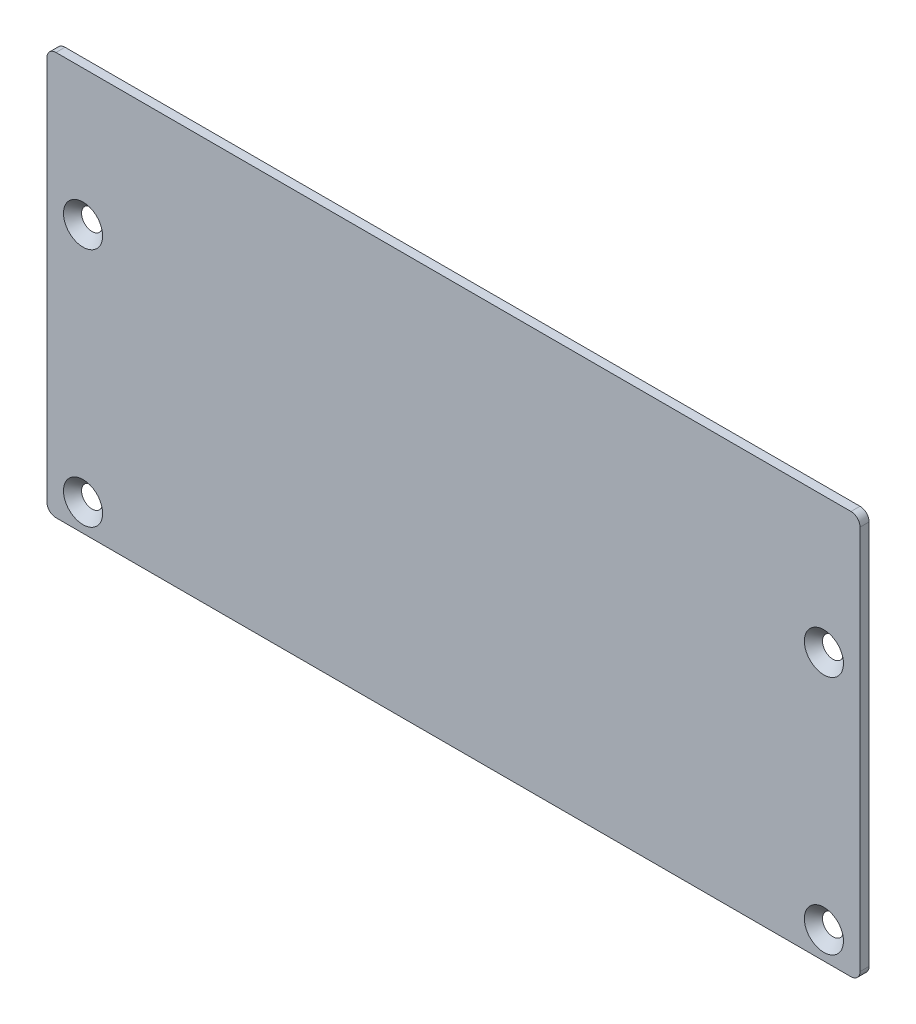
ISO-10303-21;
HEADER;
FILE_DESCRIPTION(('STEP AP214'),'2;1');
FILE_NAME('part.step','',(''),(''),'','','');
FILE_SCHEMA(('AUTOMOTIVE_DESIGN { 1 0 10303 214 1 1 1 1 }'));
ENDSEC;
DATA;
#1=APPLICATION_CONTEXT('core data for automotive mechanical design processes');
#2=APPLICATION_PROTOCOL_DEFINITION('international standard','automotive_design',2000,#1);
#3=PRODUCT_CONTEXT('',#1,'mechanical');
#4=PRODUCT('Part','Part','',(#3));
#5=PRODUCT_RELATED_PRODUCT_CATEGORY('part','',(#4));
#6=PRODUCT_DEFINITION_FORMATION('','',#4);
#7=PRODUCT_DEFINITION_CONTEXT('part definition',#1,'design');
#8=PRODUCT_DEFINITION('design','',#6,#7);
#9=PRODUCT_DEFINITION_SHAPE('','',#8);
#10=(LENGTH_UNIT() NAMED_UNIT(*) SI_UNIT(.MILLI.,.METRE.));
#11=(NAMED_UNIT(*) PLANE_ANGLE_UNIT() SI_UNIT($,.RADIAN.));
#12=(NAMED_UNIT(*) SI_UNIT($,.STERADIAN.) SOLID_ANGLE_UNIT());
#13=UNCERTAINTY_MEASURE_WITH_UNIT(LENGTH_MEASURE(1.E-05),#10,'distance_accuracy_value','');
#14=(GEOMETRIC_REPRESENTATION_CONTEXT(3) GLOBAL_UNCERTAINTY_ASSIGNED_CONTEXT((#13)) GLOBAL_UNIT_ASSIGNED_CONTEXT((#10,
#11,#12)) REPRESENTATION_CONTEXT('',''));
#15=CARTESIAN_POINT('',(0.,0.,0.));
#16=DIRECTION('',(0.,0.,1.));
#17=DIRECTION('',(1.,0.,0.));
#18=AXIS2_PLACEMENT_3D('',#15,#16,#17);
#19=CARTESIAN_POINT('',(-25.0657894736842,38.0216992481203,1.27));
#20=DIRECTION('',(1.,0.,0.));
#21=DIRECTION('',(0.,1.,0.));
#22=AXIS2_PLACEMENT_3D('',#19,#20,#21);
#23=PLANE('',#22);
#24=DIRECTION('',(0.,-1.,0.));
#25=VECTOR('',#24,1.);
#26=CARTESIAN_POINT('',(-25.0657894736842,38.0216992481203,0.));
#27=LINE('',#26,#25);
#28=CARTESIAN_POINT('',(-25.0657894736842,36.7516992481203,0.));
#29=VERTEX_POINT('',#28);
#30=CARTESIAN_POINT('',(-25.0657894736842,-17.3503007518797,0.));
#31=VERTEX_POINT('',#30);
#32=EDGE_CURVE('E141',#29,#31,#27,.T.);
#33=ORIENTED_EDGE('',*,*,#32,.T.);
#34=DIRECTION('',(0.,0.,-1.));
#35=VECTOR('',#34,1.);
#36=CARTESIAN_POINT('',(-25.0657894736842,-17.3503007518797,1.27));
#37=LINE('',#36,#35);
#38=CARTESIAN_POINT('',(-25.0657894736842,-17.3503007518797,1.27));
#39=VERTEX_POINT('',#38);
#40=EDGE_CURVE('E119',#31,#39,#37,.F.);
#41=ORIENTED_EDGE('',*,*,#40,.T.);
#42=DIRECTION('',(0.,-1.,0.));
#43=VECTOR('',#42,1.);
#44=CARTESIAN_POINT('',(-25.0657894736842,38.0216992481203,1.27));
#45=LINE('',#44,#43);
#46=CARTESIAN_POINT('',(-25.0657894736842,36.7516992481203,1.27));
#47=VERTEX_POINT('',#46);
#48=EDGE_CURVE('E151',#47,#39,#45,.T.);
#49=ORIENTED_EDGE('',*,*,#48,.F.);
#50=DIRECTION('',(0.,0.,-1.));
#51=VECTOR('',#50,1.);
#52=CARTESIAN_POINT('',(-25.0657894736842,36.7516992481203,1.27));
#53=LINE('',#52,#51);
#54=EDGE_CURVE('E124',#47,#29,#53,.T.);
#55=ORIENTED_EDGE('',*,*,#54,.T.);
#56=EDGE_LOOP('',(#33,#41,#49,#55));
#57=FACE_BOUND('',#56,.T.);
#58=ADVANCED_FACE('F48',(#57),#23,.F.);
#59=CARTESIAN_POINT('',(-25.0657894736842,-18.6203007518797,1.27));
#60=DIRECTION('',(0.,1.,0.));
#61=DIRECTION('',(0.,0.,1.));
#62=AXIS2_PLACEMENT_3D('',#59,#60,#61);
#63=PLANE('',#62);
#64=DIRECTION('',(1.,0.,0.));
#65=VECTOR('',#64,1.);
#66=CARTESIAN_POINT('',(-25.0657894736842,-18.6203007518797,1.27));
#67=LINE('',#66,#65);
#68=CARTESIAN_POINT('',(-23.7957894736842,-18.6203007518797,1.27));
#69=VERTEX_POINT('',#68);
#70=CARTESIAN_POINT('',(87.9642105263158,-18.6203007518797,1.27));
#71=VERTEX_POINT('',#70);
#72=EDGE_CURVE('E134',#69,#71,#67,.T.);
#73=ORIENTED_EDGE('',*,*,#72,.F.);
#74=DIRECTION('',(0.,0.,-1.));
#75=VECTOR('',#74,1.);
#76=CARTESIAN_POINT('',(-23.7957894736842,-18.6203007518797,1.27));
#77=LINE('',#76,#75);
#78=CARTESIAN_POINT('',(-23.7957894736842,-18.6203007518797,0.));
#79=VERTEX_POINT('',#78);
#80=EDGE_CURVE('E118',#69,#79,#77,.T.);
#81=ORIENTED_EDGE('',*,*,#80,.T.);
#82=DIRECTION('',(1.,0.,0.));
#83=VECTOR('',#82,1.);
#84=CARTESIAN_POINT('',(-25.0657894736842,-18.6203007518797,0.));
#85=LINE('',#84,#83);
#86=CARTESIAN_POINT('',(87.9642105263158,-18.6203007518797,0.));
#87=VERTEX_POINT('',#86);
#88=EDGE_CURVE('E131',#79,#87,#85,.T.);
#89=ORIENTED_EDGE('',*,*,#88,.T.);
#90=DIRECTION('',(0.,0.,-1.));
#91=VECTOR('',#90,1.);
#92=CARTESIAN_POINT('',(87.9642105263158,-18.6203007518797,1.27));
#93=LINE('',#92,#91);
#94=EDGE_CURVE('E136',#87,#71,#93,.F.);
#95=ORIENTED_EDGE('',*,*,#94,.T.);
#96=EDGE_LOOP('',(#73,#81,#89,#95));
#97=FACE_BOUND('',#96,.T.);
#98=ADVANCED_FACE('F130',(#97),#63,.F.);
#99=CARTESIAN_POINT('',(89.2342105263158,38.0216992481203,1.27));
#100=DIRECTION('',(-1.,0.,0.));
#101=DIRECTION('',(0.,-1.,0.));
#102=AXIS2_PLACEMENT_3D('',#99,#100,#101);
#103=PLANE('',#102);
#104=DIRECTION('',(0.,1.,0.));
#105=VECTOR('',#104,1.);
#106=CARTESIAN_POINT('',(89.2342105263158,38.0216992481203,1.27));
#107=LINE('',#106,#105);
#108=CARTESIAN_POINT('',(89.2342105263158,-17.3503007518797,1.27));
#109=VERTEX_POINT('',#108);
#110=CARTESIAN_POINT('',(89.2342105263158,36.7516992481203,1.27));
#111=VERTEX_POINT('',#110);
#112=EDGE_CURVE('E177',#109,#111,#107,.T.);
#113=ORIENTED_EDGE('',*,*,#112,.F.);
#114=DIRECTION('',(0.,0.,-1.));
#115=VECTOR('',#114,1.);
#116=CARTESIAN_POINT('',(89.2342105263158,-17.3503007518797,1.27));
#117=LINE('',#116,#115);
#118=CARTESIAN_POINT('',(89.2342105263158,-17.3503007518797,0.));
#119=VERTEX_POINT('',#118);
#120=EDGE_CURVE('E170',#109,#119,#117,.T.);
#121=ORIENTED_EDGE('',*,*,#120,.T.);
#122=DIRECTION('',(0.,1.,0.));
#123=VECTOR('',#122,1.);
#124=CARTESIAN_POINT('',(89.2342105263158,38.0216992481203,0.));
#125=LINE('',#124,#123);
#126=CARTESIAN_POINT('',(89.2342105263158,36.7516992481203,0.));
#127=VERTEX_POINT('',#126);
#128=EDGE_CURVE('E140',#119,#127,#125,.T.);
#129=ORIENTED_EDGE('',*,*,#128,.T.);
#130=DIRECTION('',(0.,0.,-1.));
#131=VECTOR('',#130,1.);
#132=CARTESIAN_POINT('',(89.2342105263158,36.7516992481203,1.27));
#133=LINE('',#132,#131);
#134=EDGE_CURVE('E168',#127,#111,#133,.F.);
#135=ORIENTED_EDGE('',*,*,#134,.T.);
#136=EDGE_LOOP('',(#113,#121,#129,#135));
#137=FACE_BOUND('',#136,.T.);
#138=ADVANCED_FACE('F175',(#137),#103,.F.);
#139=CARTESIAN_POINT('',(-25.0657894736842,38.0216992481203,1.27));
#140=DIRECTION('',(0.,-1.,0.));
#141=DIRECTION('',(0.,0.,-1.));
#142=AXIS2_PLACEMENT_3D('',#139,#140,#141);
#143=PLANE('',#142);
#144=DIRECTION('',(-1.,0.,0.));
#145=VECTOR('',#144,1.);
#146=CARTESIAN_POINT('',(-25.0657894736842,38.0216992481203,1.27));
#147=LINE('',#146,#145);
#148=CARTESIAN_POINT('',(87.9642105263158,38.0216992481203,1.27));
#149=VERTEX_POINT('',#148);
#150=CARTESIAN_POINT('',(-23.7957894736842,38.0216992481203,1.27));
#151=VERTEX_POINT('',#150);
#152=EDGE_CURVE('E152',#149,#151,#147,.T.);
#153=ORIENTED_EDGE('',*,*,#152,.F.);
#154=DIRECTION('',(0.,0.,-1.));
#155=VECTOR('',#154,1.);
#156=CARTESIAN_POINT('',(87.9642105263158,38.0216992481203,1.27));
#157=LINE('',#156,#155);
#158=CARTESIAN_POINT('',(87.9642105263158,38.0216992481203,0.));
#159=VERTEX_POINT('',#158);
#160=EDGE_CURVE('E13',#149,#159,#157,.T.);
#161=ORIENTED_EDGE('',*,*,#160,.T.);
#162=DIRECTION('',(-1.,0.,0.));
#163=VECTOR('',#162,1.);
#164=CARTESIAN_POINT('',(-25.0657894736842,38.0216992481203,0.));
#165=LINE('',#164,#163);
#166=CARTESIAN_POINT('',(-23.7957894736842,38.0216992481203,0.));
#167=VERTEX_POINT('',#166);
#168=EDGE_CURVE('E144',#159,#167,#165,.T.);
#169=ORIENTED_EDGE('',*,*,#168,.T.);
#170=DIRECTION('',(0.,0.,-1.));
#171=VECTOR('',#170,1.);
#172=CARTESIAN_POINT('',(-23.7957894736842,38.0216992481203,1.27));
#173=LINE('',#172,#171);
#174=EDGE_CURVE('E56',#167,#151,#173,.F.);
#175=ORIENTED_EDGE('',*,*,#174,.T.);
#176=EDGE_LOOP('',(#153,#161,#169,#175));
#177=FACE_BOUND('',#176,.T.);
#178=ADVANCED_FACE('F184',(#177),#143,.F.);
#179=CARTESIAN_POINT('',(0.,0.,1.27));
#180=DIRECTION('',(0.,0.,1.));
#181=DIRECTION('',(1.,0.,0.));
#182=AXIS2_PLACEMENT_3D('',#179,#180,#181);
#183=PLANE('',#182);
#184=CARTESIAN_POINT('',(-19.9857894736842,18.9716992481203,1.27));
#185=DIRECTION('',(0.,0.,1.));
#186=DIRECTION('',(1.,0.,0.));
#187=AXIS2_PLACEMENT_3D('',#184,#185,#186);
#188=CIRCLE('',#187,2.75);
#189=CARTESIAN_POINT('',(-17.2357894736842,18.9716992481203,1.27));
#190=VERTEX_POINT('',#189);
#191=EDGE_CURVE('E211',#190,#190,#188,.T.);
#192=ORIENTED_EDGE('',*,*,#191,.F.);
#193=EDGE_LOOP('',(#192));
#194=FACE_BOUND('',#193,.T.);
#195=CARTESIAN_POINT('',(-19.9857894736842,-14.8103007518797,1.27));
#196=DIRECTION('',(0.,0.,1.));
#197=DIRECTION('',(1.,0.,0.));
#198=AXIS2_PLACEMENT_3D('',#195,#196,#197);
#199=CIRCLE('',#198,2.75);
#200=CARTESIAN_POINT('',(-17.2357894736842,-14.8103007518797,1.27));
#201=VERTEX_POINT('',#200);
#202=EDGE_CURVE('E205',#201,#201,#199,.T.);
#203=ORIENTED_EDGE('',*,*,#202,.F.);
#204=EDGE_LOOP('',(#203));
#205=FACE_BOUND('',#204,.T.);
#206=CARTESIAN_POINT('',(84.1542105263158,-14.8103007518797,1.27));
#207=DIRECTION('',(0.,0.,1.));
#208=DIRECTION('',(1.,0.,0.));
#209=AXIS2_PLACEMENT_3D('',#206,#207,#208);
#210=CIRCLE('',#209,2.75);
#211=CARTESIAN_POINT('',(86.9042105263158,-14.8103007518797,1.27));
#212=VERTEX_POINT('',#211);
#213=EDGE_CURVE('E199',#212,#212,#210,.T.);
#214=ORIENTED_EDGE('',*,*,#213,.F.);
#215=EDGE_LOOP('',(#214));
#216=FACE_BOUND('',#215,.T.);
#217=CARTESIAN_POINT('',(84.1542105263158,18.9716992481203,1.27));
#218=DIRECTION('',(0.,0.,1.));
#219=DIRECTION('',(1.,0.,0.));
#220=AXIS2_PLACEMENT_3D('',#217,#218,#219);
#221=CIRCLE('',#220,2.75);
#222=CARTESIAN_POINT('',(86.9042105263158,18.9716992481203,1.27));
#223=VERTEX_POINT('',#222);
#224=EDGE_CURVE('E193',#223,#223,#221,.T.);
#225=ORIENTED_EDGE('',*,*,#224,.F.);
#226=EDGE_LOOP('',(#225));
#227=FACE_BOUND('',#226,.T.);
#228=ORIENTED_EDGE('',*,*,#48,.T.);
#229=CARTESIAN_POINT('',(-23.7957894736842,-17.3503007518797,1.27));
#230=DIRECTION('',(0.,0.,1.));
#231=DIRECTION('',(1.,0.,0.));
#232=AXIS2_PLACEMENT_3D('',#229,#230,#231);
#233=CIRCLE('',#232,1.27);
#234=EDGE_CURVE('E166',#39,#69,#233,.T.);
#235=ORIENTED_EDGE('',*,*,#234,.T.);
#236=ORIENTED_EDGE('',*,*,#72,.T.);
#237=CARTESIAN_POINT('',(87.9642105263158,-17.3503007518797,1.27));
#238=DIRECTION('',(0.,0.,1.));
#239=DIRECTION('',(1.,0.,0.));
#240=AXIS2_PLACEMENT_3D('',#237,#238,#239);
#241=CIRCLE('',#240,1.27);
#242=EDGE_CURVE('E164',#71,#109,#241,.T.);
#243=ORIENTED_EDGE('',*,*,#242,.T.);
#244=ORIENTED_EDGE('',*,*,#112,.T.);
#245=CARTESIAN_POINT('',(87.9642105263158,36.7516992481203,1.27));
#246=DIRECTION('',(0.,0.,1.));
#247=DIRECTION('',(1.,0.,0.));
#248=AXIS2_PLACEMENT_3D('',#245,#246,#247);
#249=CIRCLE('',#248,1.27);
#250=EDGE_CURVE('E69',#111,#149,#249,.T.);
#251=ORIENTED_EDGE('',*,*,#250,.T.);
#252=ORIENTED_EDGE('',*,*,#152,.T.);
#253=CARTESIAN_POINT('',(-23.7957894736842,36.7516992481203,1.27));
#254=DIRECTION('',(0.,0.,1.));
#255=DIRECTION('',(1.,0.,0.));
#256=AXIS2_PLACEMENT_3D('',#253,#254,#255);
#257=CIRCLE('',#256,1.27);
#258=EDGE_CURVE('E161',#151,#47,#257,.T.);
#259=ORIENTED_EDGE('',*,*,#258,.T.);
#260=EDGE_LOOP('',(#228,#235,#236,#243,#244,#251,#252,#259));
#261=FACE_BOUND('',#260,.T.);
#262=ADVANCED_FACE('F217',(#194,#205,#216,#227,#261),#183,.T.);
#263=CARTESIAN_POINT('',(0.,0.,0.));
#264=DIRECTION('',(0.,0.,1.));
#265=DIRECTION('',(1.,0.,0.));
#266=AXIS2_PLACEMENT_3D('',#263,#264,#265);
#267=PLANE('',#266);
#268=CARTESIAN_POINT('',(-19.9857894736842,18.9716992481203,0.));
#269=DIRECTION('',(0.,0.,1.));
#270=DIRECTION('',(1.,0.,0.));
#271=AXIS2_PLACEMENT_3D('',#268,#269,#270);
#272=CIRCLE('',#271,1.48);
#273=CARTESIAN_POINT('',(-18.5057894736842,18.9716992481203,0.));
#274=VERTEX_POINT('',#273);
#275=EDGE_CURVE('E208',#274,#274,#272,.T.);
#276=ORIENTED_EDGE('',*,*,#275,.T.);
#277=EDGE_LOOP('',(#276));
#278=FACE_BOUND('',#277,.T.);
#279=CARTESIAN_POINT('',(-19.9857894736842,-14.8103007518797,0.));
#280=DIRECTION('',(0.,0.,1.));
#281=DIRECTION('',(1.,0.,0.));
#282=AXIS2_PLACEMENT_3D('',#279,#280,#281);
#283=CIRCLE('',#282,1.48);
#284=CARTESIAN_POINT('',(-18.5057894736842,-14.8103007518797,0.));
#285=VERTEX_POINT('',#284);
#286=EDGE_CURVE('E202',#285,#285,#283,.T.);
#287=ORIENTED_EDGE('',*,*,#286,.T.);
#288=EDGE_LOOP('',(#287));
#289=FACE_BOUND('',#288,.T.);
#290=CARTESIAN_POINT('',(84.1542105263158,-14.8103007518797,0.));
#291=DIRECTION('',(0.,0.,1.));
#292=DIRECTION('',(1.,0.,0.));
#293=AXIS2_PLACEMENT_3D('',#290,#291,#292);
#294=CIRCLE('',#293,1.47999999999999);
#295=CARTESIAN_POINT('',(85.6342105263158,-14.8103007518797,0.));
#296=VERTEX_POINT('',#295);
#297=EDGE_CURVE('E196',#296,#296,#294,.T.);
#298=ORIENTED_EDGE('',*,*,#297,.T.);
#299=EDGE_LOOP('',(#298));
#300=FACE_BOUND('',#299,.T.);
#301=CARTESIAN_POINT('',(84.1542105263158,18.9716992481203,0.));
#302=DIRECTION('',(0.,0.,1.));
#303=DIRECTION('',(1.,0.,0.));
#304=AXIS2_PLACEMENT_3D('',#301,#302,#303);
#305=CIRCLE('',#304,1.47999999999999);
#306=CARTESIAN_POINT('',(85.6342105263158,18.9716992481203,0.));
#307=VERTEX_POINT('',#306);
#308=EDGE_CURVE('E146',#307,#307,#305,.T.);
#309=ORIENTED_EDGE('',*,*,#308,.T.);
#310=EDGE_LOOP('',(#309));
#311=FACE_BOUND('',#310,.T.);
#312=ORIENTED_EDGE('',*,*,#88,.F.);
#313=CARTESIAN_POINT('',(-23.7957894736842,-17.3503007518797,0.));
#314=DIRECTION('',(0.,0.,1.));
#315=DIRECTION('',(1.,0.,0.));
#316=AXIS2_PLACEMENT_3D('',#313,#314,#315);
#317=CIRCLE('',#316,1.27);
#318=EDGE_CURVE('E114',#79,#31,#317,.F.);
#319=ORIENTED_EDGE('',*,*,#318,.T.);
#320=ORIENTED_EDGE('',*,*,#32,.F.);
#321=CARTESIAN_POINT('',(-23.7957894736842,36.7516992481203,0.));
#322=DIRECTION('',(0.,0.,1.));
#323=DIRECTION('',(1.,0.,0.));
#324=AXIS2_PLACEMENT_3D('',#321,#322,#323);
#325=CIRCLE('',#324,1.27);
#326=EDGE_CURVE('E135',#29,#167,#325,.F.);
#327=ORIENTED_EDGE('',*,*,#326,.T.);
#328=ORIENTED_EDGE('',*,*,#168,.F.);
#329=CARTESIAN_POINT('',(87.9642105263158,36.7516992481203,0.));
#330=DIRECTION('',(0.,0.,1.));
#331=DIRECTION('',(1.,0.,0.));
#332=AXIS2_PLACEMENT_3D('',#329,#330,#331);
#333=CIRCLE('',#332,1.27);
#334=EDGE_CURVE('E155',#159,#127,#333,.F.);
#335=ORIENTED_EDGE('',*,*,#334,.T.);
#336=ORIENTED_EDGE('',*,*,#128,.F.);
#337=CARTESIAN_POINT('',(87.9642105263158,-17.3503007518797,0.));
#338=DIRECTION('',(0.,0.,1.));
#339=DIRECTION('',(1.,0.,0.));
#340=AXIS2_PLACEMENT_3D('',#337,#338,#339);
#341=CIRCLE('',#340,1.27);
#342=EDGE_CURVE('E125',#119,#87,#341,.F.);
#343=ORIENTED_EDGE('',*,*,#342,.T.);
#344=EDGE_LOOP('',(#312,#319,#320,#327,#328,#335,#336,#343));
#345=FACE_BOUND('',#344,.T.);
#346=ADVANCED_FACE('F138',(#278,#289,#300,#311,#345),#267,.F.);
#347=CARTESIAN_POINT('',(84.1542105263158,18.9716992481203,1.27));
#348=DIRECTION('',(0.,0.,1.));
#349=DIRECTION('',(1.,0.,0.));
#350=AXIS2_PLACEMENT_3D('',#347,#348,#349);
#351=CONICAL_SURFACE('',#350,2.75,0.785398163397452);
#352=ORIENTED_EDGE('',*,*,#308,.F.);
#353=EDGE_LOOP('',(#352));
#354=FACE_BOUND('',#353,.T.);
#355=ORIENTED_EDGE('',*,*,#224,.T.);
#356=EDGE_LOOP('',(#355));
#357=FACE_BOUND('',#356,.T.);
#358=ADVANCED_FACE('F293',(#354,#357),#351,.F.);
#359=CARTESIAN_POINT('',(84.1542105263158,-14.8103007518797,1.27));
#360=DIRECTION('',(0.,0.,1.));
#361=DIRECTION('',(1.,0.,0.));
#362=AXIS2_PLACEMENT_3D('',#359,#360,#361);
#363=CONICAL_SURFACE('',#362,2.75,0.785398163397452);
#364=ORIENTED_EDGE('',*,*,#297,.F.);
#365=EDGE_LOOP('',(#364));
#366=FACE_BOUND('',#365,.T.);
#367=ORIENTED_EDGE('',*,*,#213,.T.);
#368=EDGE_LOOP('',(#367));
#369=FACE_BOUND('',#368,.T.);
#370=ADVANCED_FACE('F284',(#366,#369),#363,.F.);
#371=CARTESIAN_POINT('',(-19.9857894736842,-14.8103007518797,1.27));
#372=DIRECTION('',(0.,0.,1.));
#373=DIRECTION('',(1.,0.,0.));
#374=AXIS2_PLACEMENT_3D('',#371,#372,#373);
#375=CONICAL_SURFACE('',#374,2.75,0.785398163397448);
#376=ORIENTED_EDGE('',*,*,#286,.F.);
#377=EDGE_LOOP('',(#376));
#378=FACE_BOUND('',#377,.T.);
#379=ORIENTED_EDGE('',*,*,#202,.T.);
#380=EDGE_LOOP('',(#379));
#381=FACE_BOUND('',#380,.T.);
#382=ADVANCED_FACE('F275',(#378,#381),#375,.F.);
#383=CARTESIAN_POINT('',(-19.9857894736842,18.9716992481203,1.27));
#384=DIRECTION('',(0.,0.,1.));
#385=DIRECTION('',(1.,0.,0.));
#386=AXIS2_PLACEMENT_3D('',#383,#384,#385);
#387=CONICAL_SURFACE('',#386,2.75,0.785398163397448);
#388=ORIENTED_EDGE('',*,*,#275,.F.);
#389=EDGE_LOOP('',(#388));
#390=FACE_BOUND('',#389,.T.);
#391=ORIENTED_EDGE('',*,*,#191,.T.);
#392=EDGE_LOOP('',(#391));
#393=FACE_BOUND('',#392,.T.);
#394=ADVANCED_FACE('F215',(#390,#393),#387,.F.);
#395=CARTESIAN_POINT('',(-23.7957894736842,-17.3503007518797,1.27));
#396=DIRECTION('',(0.,0.,-1.));
#397=DIRECTION('',(-1.,0.,0.));
#398=AXIS2_PLACEMENT_3D('',#395,#396,#397);
#399=CYLINDRICAL_SURFACE('',#398,1.27);
#400=ORIENTED_EDGE('',*,*,#234,.F.);
#401=ORIENTED_EDGE('',*,*,#40,.F.);
#402=ORIENTED_EDGE('',*,*,#318,.F.);
#403=ORIENTED_EDGE('',*,*,#80,.F.);
#404=EDGE_LOOP('',(#400,#401,#402,#403));
#405=FACE_BOUND('',#404,.T.);
#406=ADVANCED_FACE('F117',(#405),#399,.T.);
#407=CARTESIAN_POINT('',(87.9642105263158,-17.3503007518797,1.27));
#408=DIRECTION('',(0.,0.,-1.));
#409=DIRECTION('',(-1.,0.,0.));
#410=AXIS2_PLACEMENT_3D('',#407,#408,#409);
#411=CYLINDRICAL_SURFACE('',#410,1.27);
#412=ORIENTED_EDGE('',*,*,#242,.F.);
#413=ORIENTED_EDGE('',*,*,#94,.F.);
#414=ORIENTED_EDGE('',*,*,#342,.F.);
#415=ORIENTED_EDGE('',*,*,#120,.F.);
#416=EDGE_LOOP('',(#412,#413,#414,#415));
#417=FACE_BOUND('',#416,.T.);
#418=ADVANCED_FACE('F234',(#417),#411,.T.);
#419=CARTESIAN_POINT('',(87.9642105263158,36.7516992481203,1.27));
#420=DIRECTION('',(0.,0.,-1.));
#421=DIRECTION('',(-1.,0.,0.));
#422=AXIS2_PLACEMENT_3D('',#419,#420,#421);
#423=CYLINDRICAL_SURFACE('',#422,1.27);
#424=ORIENTED_EDGE('',*,*,#250,.F.);
#425=ORIENTED_EDGE('',*,*,#134,.F.);
#426=ORIENTED_EDGE('',*,*,#334,.F.);
#427=ORIENTED_EDGE('',*,*,#160,.F.);
#428=EDGE_LOOP('',(#424,#425,#426,#427));
#429=FACE_BOUND('',#428,.T.);
#430=ADVANCED_FACE('F183',(#429),#423,.T.);
#431=CARTESIAN_POINT('',(-23.7957894736842,36.7516992481203,1.27));
#432=DIRECTION('',(0.,0.,-1.));
#433=DIRECTION('',(-1.,0.,0.));
#434=AXIS2_PLACEMENT_3D('',#431,#432,#433);
#435=CYLINDRICAL_SURFACE('',#434,1.27);
#436=ORIENTED_EDGE('',*,*,#258,.F.);
#437=ORIENTED_EDGE('',*,*,#174,.F.);
#438=ORIENTED_EDGE('',*,*,#326,.F.);
#439=ORIENTED_EDGE('',*,*,#54,.F.);
#440=EDGE_LOOP('',(#436,#437,#438,#439));
#441=FACE_BOUND('',#440,.T.);
#442=ADVANCED_FACE('F50',(#441),#435,.T.);
#443=CLOSED_SHELL('',(#58,#98,#138,#178,#262,#346,#358,#370,#382,#394,#406,#418,#430,#442));
#444=MANIFOLD_SOLID_BREP('B2',#443);
#445=ADVANCED_BREP_SHAPE_REPRESENTATION('',(#18,#444),#14);
#446=SHAPE_DEFINITION_REPRESENTATION(#9,#445);
ENDSEC;
END-ISO-10303-21;
